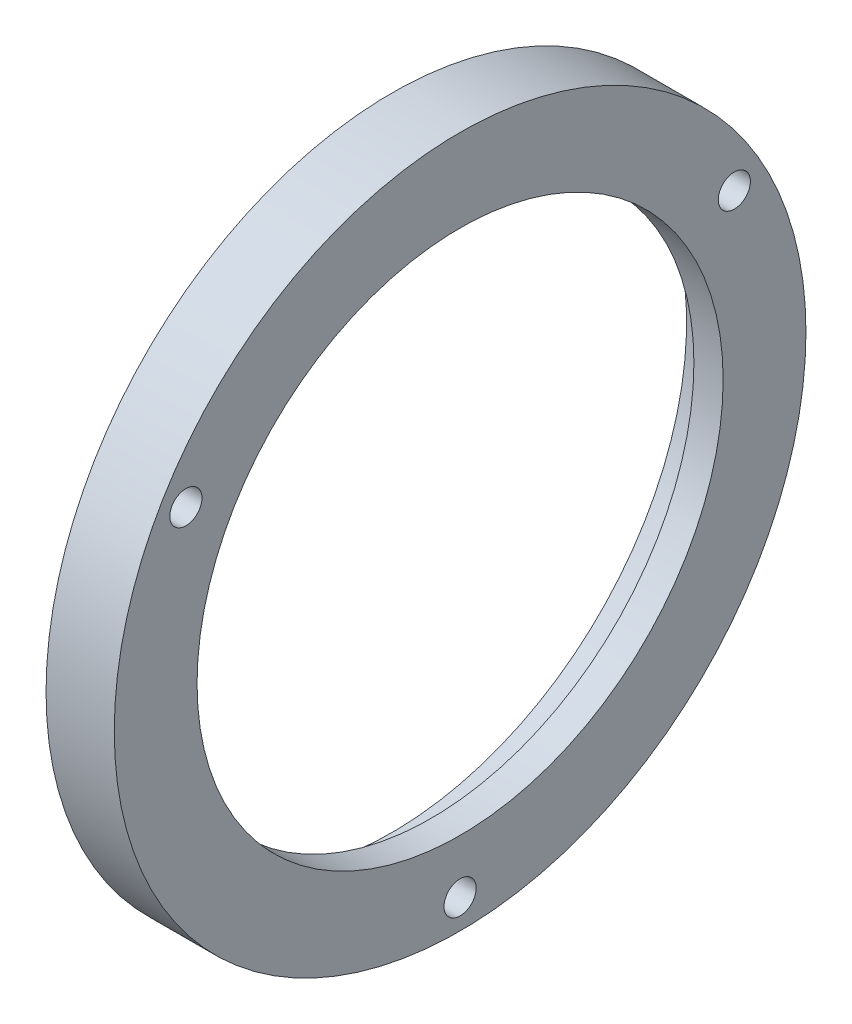
ISO-10303-21;
HEADER;
FILE_DESCRIPTION(('STEP AP214'),'2;1');
FILE_NAME('part.step','',(''),(''),'','','');
FILE_SCHEMA(('AUTOMOTIVE_DESIGN { 1 0 10303 214 1 1 1 1 }'));
ENDSEC;
DATA;
#1=APPLICATION_CONTEXT('core data for automotive mechanical design processes');
#2=APPLICATION_PROTOCOL_DEFINITION('international standard','automotive_design',2000,#1);
#3=PRODUCT_CONTEXT('',#1,'mechanical');
#4=PRODUCT('Part','Part','',(#3));
#5=PRODUCT_RELATED_PRODUCT_CATEGORY('part','',(#4));
#6=PRODUCT_DEFINITION_FORMATION('','',#4);
#7=PRODUCT_DEFINITION_CONTEXT('part definition',#1,'design');
#8=PRODUCT_DEFINITION('design','',#6,#7);
#9=PRODUCT_DEFINITION_SHAPE('','',#8);
#10=(LENGTH_UNIT() NAMED_UNIT(*) SI_UNIT(.MILLI.,.METRE.));
#11=(NAMED_UNIT(*) PLANE_ANGLE_UNIT() SI_UNIT($,.RADIAN.));
#12=(NAMED_UNIT(*) SI_UNIT($,.STERADIAN.) SOLID_ANGLE_UNIT());
#13=UNCERTAINTY_MEASURE_WITH_UNIT(LENGTH_MEASURE(1.E-05),#10,'distance_accuracy_value','');
#14=(GEOMETRIC_REPRESENTATION_CONTEXT(3) GLOBAL_UNCERTAINTY_ASSIGNED_CONTEXT((#13)) GLOBAL_UNIT_ASSIGNED_CONTEXT((#10,
#11,#12)) REPRESENTATION_CONTEXT('',''));
#15=CARTESIAN_POINT('',(0.,0.,0.));
#16=DIRECTION('',(0.,0.,1.));
#17=DIRECTION('',(1.,0.,0.));
#18=AXIS2_PLACEMENT_3D('',#15,#16,#17);
#19=CARTESIAN_POINT('',(135.7,35.5,0.));
#20=DIRECTION('',(1.,0.,0.));
#21=DIRECTION('',(0.,0.,-1.));
#22=AXIS2_PLACEMENT_3D('',#19,#20,#21);
#23=PLANE('',#22);
#24=CARTESIAN_POINT('',(135.7,16.25,28.1458256229943));
#25=DIRECTION('',(1.,0.,0.));
#26=DIRECTION('',(0.,0.,-1.));
#27=AXIS2_PLACEMENT_3D('',#24,#25,#26);
#28=CIRCLE('',#27,1.65);
#29=CARTESIAN_POINT('',(135.7,16.25,26.4958256229943));
#30=VERTEX_POINT('',#29);
#31=EDGE_CURVE('E56',#30,#30,#28,.F.);
#32=ORIENTED_EDGE('',*,*,#31,.F.);
#33=EDGE_LOOP('',(#32));
#34=FACE_BOUND('',#33,.T.);
#35=CARTESIAN_POINT('',(135.7,-32.5,0.));
#36=DIRECTION('',(1.,0.,0.));
#37=DIRECTION('',(0.,0.,-1.));
#38=AXIS2_PLACEMENT_3D('',#35,#36,#37);
#39=CIRCLE('',#38,1.65);
#40=CARTESIAN_POINT('',(135.7,-32.5,-1.65));
#41=VERTEX_POINT('',#40);
#42=EDGE_CURVE('E59',#41,#41,#39,.F.);
#43=ORIENTED_EDGE('',*,*,#42,.F.);
#44=EDGE_LOOP('',(#43));
#45=FACE_BOUND('',#44,.T.);
#46=CARTESIAN_POINT('',(135.7,16.25,-28.1458256229943));
#47=DIRECTION('',(1.,0.,0.));
#48=DIRECTION('',(0.,0.,-1.));
#49=AXIS2_PLACEMENT_3D('',#46,#47,#48);
#50=CIRCLE('',#49,1.65);
#51=CARTESIAN_POINT('',(135.7,16.25,-29.7958256229943));
#52=VERTEX_POINT('',#51);
#53=EDGE_CURVE('E62',#52,#52,#50,.F.);
#54=ORIENTED_EDGE('',*,*,#53,.F.);
#55=EDGE_LOOP('',(#54));
#56=FACE_BOUND('',#55,.T.);
#57=CARTESIAN_POINT('',(135.7,0.,0.));
#58=DIRECTION('',(-1.,0.,0.));
#59=DIRECTION('',(0.,0.,1.));
#60=AXIS2_PLACEMENT_3D('',#57,#58,#59);
#61=CIRCLE('',#60,30.25);
#62=CARTESIAN_POINT('',(135.7,0.,30.25));
#63=VERTEX_POINT('',#62);
#64=EDGE_CURVE('E10',#63,#63,#61,.T.);
#65=ORIENTED_EDGE('',*,*,#64,.F.);
#66=EDGE_LOOP('',(#65));
#67=FACE_BOUND('',#66,.T.);
#68=CARTESIAN_POINT('',(135.7,0.,0.));
#69=DIRECTION('',(-1.,0.,0.));
#70=DIRECTION('',(0.,0.,1.));
#71=AXIS2_PLACEMENT_3D('',#68,#69,#70);
#72=CIRCLE('',#71,35.5);
#73=CARTESIAN_POINT('',(135.7,0.,35.5));
#74=VERTEX_POINT('',#73);
#75=EDGE_CURVE('E53',#74,#74,#72,.T.);
#76=ORIENTED_EDGE('',*,*,#75,.T.);
#77=EDGE_LOOP('',(#76));
#78=FACE_BOUND('',#77,.T.);
#79=ADVANCED_FACE('F31',(#34,#45,#56,#67,#78),#23,.F.);
#80=CARTESIAN_POINT('',(-110.,0.,0.));
#81=DIRECTION('',(-1.,0.,0.));
#82=DIRECTION('',(0.,0.,1.));
#83=AXIS2_PLACEMENT_3D('',#80,#81,#82);
#84=CYLINDRICAL_SURFACE('',#83,30.25);
#85=CARTESIAN_POINT('',(139.7,0.,0.));
#86=DIRECTION('',(-1.,0.,0.));
#87=DIRECTION('',(0.,0.,1.));
#88=AXIS2_PLACEMENT_3D('',#85,#86,#87);
#89=CIRCLE('',#88,30.25);
#90=CARTESIAN_POINT('',(139.7,0.,30.25));
#91=VERTEX_POINT('',#90);
#92=EDGE_CURVE('E37',#91,#91,#89,.T.);
#93=ORIENTED_EDGE('',*,*,#92,.F.);
#94=EDGE_LOOP('',(#93));
#95=FACE_BOUND('',#94,.T.);
#96=ORIENTED_EDGE('',*,*,#64,.T.);
#97=EDGE_LOOP('',(#96));
#98=FACE_BOUND('',#97,.T.);
#99=ADVANCED_FACE('F99',(#95,#98),#84,.F.);
#100=CARTESIAN_POINT('',(139.7,30.25,0.));
#101=DIRECTION('',(1.,0.,0.));
#102=DIRECTION('',(0.,0.,-1.));
#103=AXIS2_PLACEMENT_3D('',#100,#101,#102);
#104=PLANE('',#103);
#105=CARTESIAN_POINT('',(139.7,0.,0.));
#106=DIRECTION('',(-1.,0.,0.));
#107=DIRECTION('',(0.,0.,1.));
#108=AXIS2_PLACEMENT_3D('',#105,#106,#107);
#109=CIRCLE('',#108,27.);
#110=CARTESIAN_POINT('',(139.7,0.,27.));
#111=VERTEX_POINT('',#110);
#112=EDGE_CURVE('E41',#111,#111,#109,.T.);
#113=ORIENTED_EDGE('',*,*,#112,.F.);
#114=EDGE_LOOP('',(#113));
#115=FACE_BOUND('',#114,.T.);
#116=ORIENTED_EDGE('',*,*,#92,.T.);
#117=EDGE_LOOP('',(#116));
#118=FACE_BOUND('',#117,.T.);
#119=ADVANCED_FACE('F94',(#115,#118),#104,.F.);
#120=CARTESIAN_POINT('',(-110.,0.,0.));
#121=DIRECTION('',(-1.,0.,0.));
#122=DIRECTION('',(0.,0.,1.));
#123=AXIS2_PLACEMENT_3D('',#120,#121,#122);
#124=CYLINDRICAL_SURFACE('',#123,27.);
#125=CARTESIAN_POINT('',(142.7,0.,0.));
#126=DIRECTION('',(-1.,0.,0.));
#127=DIRECTION('',(0.,0.,1.));
#128=AXIS2_PLACEMENT_3D('',#125,#126,#127);
#129=CIRCLE('',#128,27.);
#130=CARTESIAN_POINT('',(142.7,0.,27.));
#131=VERTEX_POINT('',#130);
#132=EDGE_CURVE('E45',#131,#131,#129,.T.);
#133=ORIENTED_EDGE('',*,*,#132,.F.);
#134=EDGE_LOOP('',(#133));
#135=FACE_BOUND('',#134,.T.);
#136=ORIENTED_EDGE('',*,*,#112,.T.);
#137=EDGE_LOOP('',(#136));
#138=FACE_BOUND('',#137,.T.);
#139=ADVANCED_FACE('F82',(#135,#138),#124,.F.);
#140=CARTESIAN_POINT('',(142.7,27.,0.));
#141=DIRECTION('',(-1.,0.,0.));
#142=DIRECTION('',(0.,0.,1.));
#143=AXIS2_PLACEMENT_3D('',#140,#141,#142);
#144=PLANE('',#143);
#145=CARTESIAN_POINT('',(142.7,16.25,28.1458256229943));
#146=DIRECTION('',(1.,0.,0.));
#147=DIRECTION('',(0.,0.,-1.));
#148=AXIS2_PLACEMENT_3D('',#145,#146,#147);
#149=CIRCLE('',#148,1.65);
#150=CARTESIAN_POINT('',(142.7,16.25,26.4958256229943));
#151=VERTEX_POINT('',#150);
#152=EDGE_CURVE('E65',#151,#151,#149,.T.);
#153=ORIENTED_EDGE('',*,*,#152,.F.);
#154=EDGE_LOOP('',(#153));
#155=FACE_BOUND('',#154,.T.);
#156=CARTESIAN_POINT('',(142.7,-32.5,0.));
#157=DIRECTION('',(1.,0.,0.));
#158=DIRECTION('',(0.,0.,-1.));
#159=AXIS2_PLACEMENT_3D('',#156,#157,#158);
#160=CIRCLE('',#159,1.65);
#161=CARTESIAN_POINT('',(142.7,-32.5,-1.65));
#162=VERTEX_POINT('',#161);
#163=EDGE_CURVE('E69',#162,#162,#160,.T.);
#164=ORIENTED_EDGE('',*,*,#163,.F.);
#165=EDGE_LOOP('',(#164));
#166=FACE_BOUND('',#165,.T.);
#167=CARTESIAN_POINT('',(142.7,16.25,-28.1458256229943));
#168=DIRECTION('',(1.,0.,0.));
#169=DIRECTION('',(0.,0.,-1.));
#170=AXIS2_PLACEMENT_3D('',#167,#168,#169);
#171=CIRCLE('',#170,1.65);
#172=CARTESIAN_POINT('',(142.7,16.25,-29.7958256229943));
#173=VERTEX_POINT('',#172);
#174=EDGE_CURVE('E66',#173,#173,#171,.T.);
#175=ORIENTED_EDGE('',*,*,#174,.F.);
#176=EDGE_LOOP('',(#175));
#177=FACE_BOUND('',#176,.T.);
#178=CARTESIAN_POINT('',(142.7,0.,0.));
#179=DIRECTION('',(-1.,0.,0.));
#180=DIRECTION('',(0.,0.,1.));
#181=AXIS2_PLACEMENT_3D('',#178,#179,#180);
#182=CIRCLE('',#181,35.5);
#183=CARTESIAN_POINT('',(142.7,0.,35.5));
#184=VERTEX_POINT('',#183);
#185=EDGE_CURVE('E50',#184,#184,#182,.T.);
#186=ORIENTED_EDGE('',*,*,#185,.F.);
#187=EDGE_LOOP('',(#186));
#188=FACE_BOUND('',#187,.T.);
#189=ORIENTED_EDGE('',*,*,#132,.T.);
#190=EDGE_LOOP('',(#189));
#191=FACE_BOUND('',#190,.T.);
#192=ADVANCED_FACE('F78',(#155,#166,#177,#188,#191),#144,.F.);
#193=CARTESIAN_POINT('',(-110.,0.,0.));
#194=DIRECTION('',(-1.,0.,0.));
#195=DIRECTION('',(0.,0.,1.));
#196=AXIS2_PLACEMENT_3D('',#193,#194,#195);
#197=CYLINDRICAL_SURFACE('',#196,35.5);
#198=ORIENTED_EDGE('',*,*,#75,.F.);
#199=EDGE_LOOP('',(#198));
#200=FACE_BOUND('',#199,.T.);
#201=ORIENTED_EDGE('',*,*,#185,.T.);
#202=EDGE_LOOP('',(#201));
#203=FACE_BOUND('',#202,.T.);
#204=ADVANCED_FACE('F81',(#200,#203),#197,.T.);
#205=CARTESIAN_POINT('',(142.7,16.25,-28.1458256229943));
#206=DIRECTION('',(-1.,0.,0.));
#207=DIRECTION('',(0.,0.,1.));
#208=AXIS2_PLACEMENT_3D('',#205,#206,#207);
#209=CYLINDRICAL_SURFACE('',#208,1.65);
#210=ORIENTED_EDGE('',*,*,#174,.T.);
#211=EDGE_LOOP('',(#210));
#212=FACE_BOUND('',#211,.T.);
#213=ORIENTED_EDGE('',*,*,#53,.T.);
#214=EDGE_LOOP('',(#213));
#215=FACE_BOUND('',#214,.T.);
#216=ADVANCED_FACE('F120',(#212,#215),#209,.F.);
#217=CARTESIAN_POINT('',(142.7,-32.5,0.));
#218=DIRECTION('',(-1.,0.,0.));
#219=DIRECTION('',(0.,0.,1.));
#220=AXIS2_PLACEMENT_3D('',#217,#218,#219);
#221=CYLINDRICAL_SURFACE('',#220,1.65);
#222=ORIENTED_EDGE('',*,*,#163,.T.);
#223=EDGE_LOOP('',(#222));
#224=FACE_BOUND('',#223,.T.);
#225=ORIENTED_EDGE('',*,*,#42,.T.);
#226=EDGE_LOOP('',(#225));
#227=FACE_BOUND('',#226,.T.);
#228=ADVANCED_FACE('F125',(#224,#227),#221,.F.);
#229=CARTESIAN_POINT('',(142.7,16.25,28.1458256229943));
#230=DIRECTION('',(-1.,0.,0.));
#231=DIRECTION('',(0.,0.,1.));
#232=AXIS2_PLACEMENT_3D('',#229,#230,#231);
#233=CYLINDRICAL_SURFACE('',#232,1.65);
#234=ORIENTED_EDGE('',*,*,#152,.T.);
#235=EDGE_LOOP('',(#234));
#236=FACE_BOUND('',#235,.T.);
#237=ORIENTED_EDGE('',*,*,#31,.T.);
#238=EDGE_LOOP('',(#237));
#239=FACE_BOUND('',#238,.T.);
#240=ADVANCED_FACE('F75',(#236,#239),#233,.F.);
#241=CLOSED_SHELL('',(#79,#99,#119,#139,#192,#204,#216,#228,#240));
#242=MANIFOLD_SOLID_BREP('B2',#241);
#243=ADVANCED_BREP_SHAPE_REPRESENTATION('',(#18,#242),#14);
#244=SHAPE_DEFINITION_REPRESENTATION(#9,#243);
ENDSEC;
END-ISO-10303-21;
